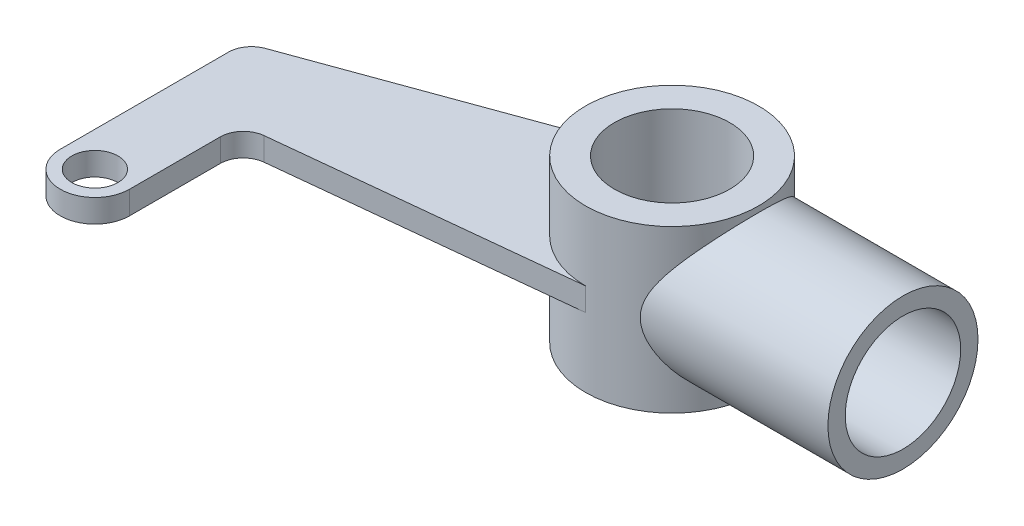
ISO-10303-21;
HEADER;
FILE_DESCRIPTION(('STEP AP214'),'2;1');
FILE_NAME('part.step','',(''),(''),'','','');
FILE_SCHEMA(('AUTOMOTIVE_DESIGN { 1 0 10303 214 1 1 1 1 }'));
ENDSEC;
DATA;
#1=APPLICATION_CONTEXT('core data for automotive mechanical design processes');
#2=APPLICATION_PROTOCOL_DEFINITION('international standard','automotive_design',2000,#1);
#3=PRODUCT_CONTEXT('',#1,'mechanical');
#4=PRODUCT('Part','Part','',(#3));
#5=PRODUCT_RELATED_PRODUCT_CATEGORY('part','',(#4));
#6=PRODUCT_DEFINITION_FORMATION('','',#4);
#7=PRODUCT_DEFINITION_CONTEXT('part definition',#1,'design');
#8=PRODUCT_DEFINITION('design','',#6,#7);
#9=PRODUCT_DEFINITION_SHAPE('','',#8);
#10=(LENGTH_UNIT() NAMED_UNIT(*) SI_UNIT(.MILLI.,.METRE.));
#11=(NAMED_UNIT(*) PLANE_ANGLE_UNIT() SI_UNIT($,.RADIAN.));
#12=(NAMED_UNIT(*) SI_UNIT($,.STERADIAN.) SOLID_ANGLE_UNIT());
#13=UNCERTAINTY_MEASURE_WITH_UNIT(LENGTH_MEASURE(1.E-05),#10,'distance_accuracy_value','');
#14=(GEOMETRIC_REPRESENTATION_CONTEXT(3) GLOBAL_UNCERTAINTY_ASSIGNED_CONTEXT((#13)) GLOBAL_UNIT_ASSIGNED_CONTEXT((#10,
#11,#12)) REPRESENTATION_CONTEXT('',''));
#15=CARTESIAN_POINT('',(0.,0.,0.));
#16=DIRECTION('',(0.,0.,1.));
#17=DIRECTION('',(1.,0.,0.));
#18=AXIS2_PLACEMENT_3D('',#15,#16,#17);
#19=CARTESIAN_POINT('',(0.,70.,0.));
#20=DIRECTION('',(0.,-1.,0.));
#21=DIRECTION('',(0.,0.,-1.));
#22=AXIS2_PLACEMENT_3D('',#19,#20,#21);
#23=CYLINDRICAL_SURFACE('',#22,37.5);
#24=DIRECTION('',(0.,-1.,0.));
#25=VECTOR('',#24,1.);
#26=CARTESIAN_POINT('',(-12.8257553747126,40.,-35.2384732794716));
#27=LINE('',#26,#25);
#28=CARTESIAN_POINT('',(-12.8257553747126,40.,-35.2384732794716));
#29=VERTEX_POINT('',#28);
#30=CARTESIAN_POINT('',(-12.8257553747126,30.,-35.2384732794716));
#31=VERTEX_POINT('',#30);
#32=EDGE_CURVE('E131',#29,#31,#27,.T.);
#33=ORIENTED_EDGE('',*,*,#32,.F.);
#34=CARTESIAN_POINT('',(0.,40.,0.));
#35=DIRECTION('',(0.,1.,0.));
#36=DIRECTION('',(0.,0.,1.));
#37=AXIS2_PLACEMENT_3D('',#34,#35,#36);
#38=CIRCLE('',#37,37.5);
#39=CARTESIAN_POINT('',(0.,40.,37.5));
#40=VERTEX_POINT('',#39);
#41=EDGE_CURVE('E164',#29,#40,#38,.T.);
#42=ORIENTED_EDGE('',*,*,#41,.T.);
#43=DIRECTION('',(0.,-1.,0.));
#44=VECTOR('',#43,1.);
#45=CARTESIAN_POINT('',(0.,40.,37.5));
#46=LINE('',#45,#44);
#47=CARTESIAN_POINT('',(0.,30.,37.5));
#48=VERTEX_POINT('',#47);
#49=EDGE_CURVE('E147',#40,#48,#46,.T.);
#50=ORIENTED_EDGE('',*,*,#49,.T.);
#51=CARTESIAN_POINT('',(0.,30.,0.));
#52=DIRECTION('',(0.,1.,0.));
#53=DIRECTION('',(0.,0.,1.));
#54=AXIS2_PLACEMENT_3D('',#51,#52,#53);
#55=CIRCLE('',#54,37.5);
#56=EDGE_CURVE('E148',#31,#48,#55,.T.);
#57=ORIENTED_EDGE('',*,*,#56,.F.);
#58=EDGE_LOOP('',(#33,#42,#50,#57));
#59=FACE_BOUND('',#58,.T.);
#60=CARTESIAN_POINT('',(0.,0.,0.));
#61=DIRECTION('',(0.,1.,0.));
#62=DIRECTION('',(0.,0.,1.));
#63=AXIS2_PLACEMENT_3D('',#60,#61,#62);
#64=CIRCLE('',#63,37.5);
#65=CARTESIAN_POINT('',(0.,0.,37.5));
#66=VERTEX_POINT('',#65);
#67=EDGE_CURVE('E220',#66,#66,#64,.T.);
#68=ORIENTED_EDGE('',*,*,#67,.T.);
#69=EDGE_LOOP('',(#68));
#70=FACE_BOUND('',#69,.T.);
#71=CARTESIAN_POINT('',(0.,70.,0.));
#72=DIRECTION('',(0.,1.,0.));
#73=DIRECTION('',(0.,0.,1.));
#74=AXIS2_PLACEMENT_3D('',#71,#72,#73);
#75=CIRCLE('',#74,37.5);
#76=CARTESIAN_POINT('',(0.,70.,37.5));
#77=VERTEX_POINT('',#76);
#78=EDGE_CURVE('E184',#77,#77,#75,.T.);
#79=ORIENTED_EDGE('',*,*,#78,.F.);
#80=EDGE_LOOP('',(#79));
#81=FACE_BOUND('',#80,.T.);
#82=CARTESIAN_POINT('',(18.7082869338697,35.,32.5));
#83=CARTESIAN_POINT('',(18.7083043022071,34.4660675695345,32.4999941225335));
#84=CARTESIAN_POINT('',(18.7312733105978,33.9320164639086,32.4868015820703));
#85=CARTESIAN_POINT('',(18.8218053502324,32.8689653778684,32.4344297910761));
#86=CARTESIAN_POINT('',(18.8893821258583,32.339967005263,32.3952425311289));
#87=CARTESIAN_POINT('',(19.0655385699566,31.2901030724317,32.2918813390293));
#88=CARTESIAN_POINT('',(19.1742160797346,30.7692600317192,32.2276477721166));
#89=CARTESIAN_POINT('',(19.42728070251,29.7399257839337,32.0757304141229));
#90=CARTESIAN_POINT('',(19.5716718245214,29.2314359706086,31.9880439902629));
#91=CARTESIAN_POINT('',(19.959237006877,28.0117994363563,31.7482380441458));
#92=CARTESIAN_POINT('',(20.2181481620015,27.3079126938245,31.5846435809103));
#93=CARTESIAN_POINT('',(20.7815821313981,25.9296923475213,31.2168063706547));
#94=CARTESIAN_POINT('',(21.0861307058918,25.2553757143804,31.0125406450373));
#95=CARTESIAN_POINT('',(21.7286852867957,23.9333660115807,30.5657959135613));
#96=CARTESIAN_POINT('',(22.0667925718991,23.2857624309407,30.3231998391055));
#97=CARTESIAN_POINT('',(22.765320735484,22.0177118311355,29.8023489442269));
#98=CARTESIAN_POINT('',(23.125739953274,21.3972627966937,29.5240967760644));
#99=CARTESIAN_POINT('',(23.7794456510669,20.3165544854451,28.9986711594801));
#100=CARTESIAN_POINT('',(24.0699134108835,19.851260797593,28.7582710745081));
#101=CARTESIAN_POINT('',(24.6565380972471,18.9354875842976,28.256927981852));
#102=CARTESIAN_POINT('',(24.952695571959,18.4850094976891,27.9959829872273));
#103=CARTESIAN_POINT('',(25.5481893522746,17.5983370986188,27.4536393914183));
#104=CARTESIAN_POINT('',(25.8475270738498,17.1621495348947,27.1722313228387));
#105=CARTESIAN_POINT('',(26.4469652905855,16.3041135681723,26.5891495034273));
#106=CARTESIAN_POINT('',(26.7470657598588,15.8822646853301,26.2874764317714));
#107=CARTESIAN_POINT('',(27.3456884951169,15.0533517538412,25.6641735650314));
#108=CARTESIAN_POINT('',(27.6442121255623,14.6462720793904,25.3425658983418));
#109=CARTESIAN_POINT('',(28.2381510902731,13.8466379411745,24.6790442461121));
#110=CARTESIAN_POINT('',(28.5335660973407,13.454084995688,24.337128147686));
#111=CARTESIAN_POINT('',(29.4122216326255,12.2991356074512,23.2810865463679));
#112=CARTESIAN_POINT('',(29.9883005691303,11.5588621667352,22.536227748904));
#113=CARTESIAN_POINT('',(30.9802865227855,10.3040553378671,21.1430464592879));
#114=CARTESIAN_POINT('',(31.4028725197087,9.77641936410365,20.5111807890814));
#115=CARTESIAN_POINT('',(32.2221729960013,8.7634366712037,19.1984349625766));
#116=CARTESIAN_POINT('',(32.6188882391693,8.27808870342944,18.517556254571));
#117=CARTESIAN_POINT('',(33.3794666384159,7.35479948342227,17.1085178263836));
#118=CARTESIAN_POINT('',(33.7433736722386,6.91679475341697,16.3804235636201));
#119=CARTESIAN_POINT('',(34.4322743967789,6.09268858253955,14.8778715040107));
#120=CARTESIAN_POINT('',(34.7572757863764,5.70657687090698,14.1034229256818));
#121=CARTESIAN_POINT('',(35.3058923549657,5.05788656682616,12.6580609120704));
#122=CARTESIAN_POINT('',(35.5371540059813,4.78565552716911,11.9943697687015));
#123=CARTESIAN_POINT('',(35.9656597835968,4.28280600690925,10.6407273200411));
#124=CARTESIAN_POINT('',(36.1629075796461,4.05218303746106,9.95077885723135));
#125=CARTESIAN_POINT('',(36.5198675767818,3.63581326658011,8.54825343565871));
#126=CARTESIAN_POINT('',(36.6795946517699,3.45004868164119,7.83568557123322));
#127=CARTESIAN_POINT('',(36.9585367871775,3.12618288869585,6.39194944587621));
#128=CARTESIAN_POINT('',(37.0777513974034,2.98808221035284,5.66078097834311));
#129=CARTESIAN_POINT('',(37.273672972222,2.76135899099699,4.18125681139628));
#130=CARTESIAN_POINT('',(37.350159982927,2.67299245511119,3.43283246052489));
#131=CARTESIAN_POINT('',(37.4579764323816,2.54848275517667,1.92839184636637));
#132=CARTESIAN_POINT('',(37.4893057712631,2.5123397066225,1.17237556629308));
#133=CARTESIAN_POINT('',(37.5060834539207,2.49298047237973,-0.340753671116683));
#134=CARTESIAN_POINT('',(37.4915372317256,2.50975801816767,-1.0978664879483));
#135=CARTESIAN_POINT('',(37.416910017904,2.59590117040115,-2.60679687796928));
#136=CARTESIAN_POINT('',(37.3568312478769,2.66526421112377,-3.35861470770252));
#137=CARTESIAN_POINT('',(37.1992149829224,2.84749636353658,-4.78998454409231));
#138=CARTESIAN_POINT('',(37.1051268682436,2.95636197809763,-5.47043517972536));
#139=CARTESIAN_POINT('',(36.881427200603,3.21566466396064,-6.81735620121358));
#140=CARTESIAN_POINT('',(36.7518180091912,3.36609897165401,-7.48382751328708));
#141=CARTESIAN_POINT('',(36.4592820273828,3.70644145314206,-8.79913387213584));
#142=CARTESIAN_POINT('',(36.2963531371297,3.89635211480702,-9.44796780445636));
#143=CARTESIAN_POINT('',(35.9397487534622,4.31324073046195,-10.7249244934574));
#144=CARTESIAN_POINT('',(35.7460713552333,4.54022098087085,-11.3530459641252));
#145=CARTESIAN_POINT('',(35.3158043414499,5.04628495741628,-12.6305320440628));
#146=CARTESIAN_POINT('',(35.077129634564,5.32794273830934,-13.2781725768435));
#147=CARTESIAN_POINT('',(34.5712017643138,5.92778037748321,-14.5446585759376));
#148=CARTESIAN_POINT('',(34.3039480208362,6.24596097713427,-15.1635034573745));
#149=CARTESIAN_POINT('',(33.7443059214522,6.91598078352045,-16.3711621618091));
#150=CARTESIAN_POINT('',(33.4519073366104,7.26783369480214,-16.9599636064444));
#151=CARTESIAN_POINT('',(32.8454846768685,8.00242861352655,-18.1064849196429));
#152=CARTESIAN_POINT('',(32.5314561697495,8.38517695457569,-18.6641983753066));
#153=CARTESIAN_POINT('',(31.9641830551384,9.08206511526062,-19.6155123126112));
#154=CARTESIAN_POINT('',(31.7148280726457,9.39012629235613,-20.0159232251342));
#155=CARTESIAN_POINT('',(31.2072165288768,10.0214985918369,-20.7984897089407));
#156=CARTESIAN_POINT('',(30.948961412231,10.3448072424296,-21.1806482190707));
#157=CARTESIAN_POINT('',(30.1626164105051,11.3368088947876,-22.3001844878062));
#158=CARTESIAN_POINT('',(29.6230902247481,12.0274025382207,-23.0103852603403));
#159=CARTESIAN_POINT('',(28.5237964600079,13.463492400634,-24.3598540726815));
#160=CARTESIAN_POINT('',(27.9639834073517,14.2091164138212,-24.9989477747504));
#161=CARTESIAN_POINT('',(26.8372134709904,15.7512634719527,-26.2048491655456));
#162=CARTESIAN_POINT('',(26.2702586562582,16.5477720360122,-26.7716772834931));
#163=CARTESIAN_POINT('',(25.2413299365144,18.0480640880961,-27.7404721976782));
#164=CARTESIAN_POINT('',(24.7783171419639,18.7437415915584,-28.1539414186217));
#165=CARTESIAN_POINT('',(23.866037348356,20.1713227671937,-28.9313174167041));
#166=CARTESIAN_POINT('',(23.4167733561948,20.9032342734967,-29.295213411278));
#167=CARTESIAN_POINT('',(22.5455157142376,22.4034703645888,-29.9708644584889));
#168=CARTESIAN_POINT('',(22.1234527675247,23.1716930145467,-30.2827555033572));
#169=CARTESIAN_POINT('',(21.3217815138537,24.7491679200416,-30.8524358276319));
#170=CARTESIAN_POINT('',(20.9421408522624,25.5583882133282,-31.1102664711973));
#171=CARTESIAN_POINT('',(20.3987077211667,26.858245332786,-31.4674155653084));
#172=CARTESIAN_POINT('',(20.2129016257266,27.3341970571292,-31.5868741823117));
#173=CARTESIAN_POINT('',(19.8667726825018,28.2998608354776,-31.805709827007));
#174=CARTESIAN_POINT('',(19.7064469317207,28.7895713144447,-31.9050891427009));
#175=CARTESIAN_POINT('',(19.4168890065196,29.7808435335452,-32.0821329011768));
#176=CARTESIAN_POINT('',(19.2875890472682,30.2823767592783,-32.1598447441718));
#177=CARTESIAN_POINT('',(19.0649378938387,31.2964402615863,-32.2923365784122));
#178=CARTESIAN_POINT('',(18.9715855781851,31.8089701945651,-32.3471172850557));
#179=CARTESIAN_POINT('',(18.8245441534177,32.8480480034275,-32.4329149842568));
#180=CARTESIAN_POINT('',(18.7713420138195,33.3746901889247,-32.4636403791458));
#181=CARTESIAN_POINT('',(18.7094929427089,34.4314572508869,-32.4993260783202));
#182=CARTESIAN_POINT('',(18.7008424013531,34.9615818417009,-32.504288470082));
#183=CARTESIAN_POINT('',(18.7286171882465,36.020479893398,-32.4882922973686));
#184=CARTESIAN_POINT('',(18.7650630110207,36.5492526304507,-32.467321947484));
#185=CARTESIAN_POINT('',(18.8809171103763,37.6004243916048,-32.4000826612063));
#186=CARTESIAN_POINT('',(18.960332311666,38.1228223745068,-32.3538096471624));
#187=CARTESIAN_POINT('',(19.1729063698775,39.235833918736,-32.2283581562522));
#188=CARTESIAN_POINT('',(19.3123856828298,39.8247887444941,-32.1452559036319));
#189=CARTESIAN_POINT('',(19.6345618447748,40.9856100443482,-31.9494808397581));
#190=CARTESIAN_POINT('',(19.8172695913859,41.5574721684702,-31.8368005712862));
#191=CARTESIAN_POINT('',(20.2180653838454,42.6842991462857,-31.5837950866418));
#192=CARTESIAN_POINT('',(20.4362627821891,43.2392052684371,-31.4433841292754));
#193=CARTESIAN_POINT('',(20.8999529158297,44.3301637653062,-31.1371022204275));
#194=CARTESIAN_POINT('',(21.145447144467,44.8662151064128,-30.971229875829));
#195=CARTESIAN_POINT('',(21.6203408843042,45.8440978707292,-30.6411825542736));
#196=CARTESIAN_POINT('',(21.8469634358845,46.2883769594209,-30.4802060858159));
#197=CARTESIAN_POINT('',(22.3120885837717,47.1641682173402,-30.1413917547387));
#198=CARTESIAN_POINT('',(22.5505929757376,47.5956784410531,-29.9635513398413));
#199=CARTESIAN_POINT('',(23.0367179742848,48.4466509423564,-29.591440729381));
#200=CARTESIAN_POINT('',(23.2843437026199,48.866106208164,-29.3971612211162));
#201=CARTESIAN_POINT('',(23.7861478452416,49.6931510400789,-28.9926394758951));
#202=CARTESIAN_POINT('',(24.0403259612622,50.1007411444986,-28.7823979646878));
#203=CARTESIAN_POINT('',(24.8102625363844,51.3074998131547,-28.1274708590957));
#204=CARTESIAN_POINT('',(25.3328171378199,52.0896165338526,-27.6590397185096));
#205=CARTESIAN_POINT('',(26.3820891431732,53.6095645774273,-26.660095659204));
#206=CARTESIAN_POINT('',(26.9088054932529,54.3474067289623,-26.1295980150894));
#207=CARTESIAN_POINT('',(27.9892352974585,55.8246712385639,-24.9703775165026));
#208=CARTESIAN_POINT('',(28.5425279732296,56.561192852862,-24.337547840276));
#209=CARTESIAN_POINT('',(29.6304229067152,57.9819571685857,-23.0006796954062));
#210=CARTESIAN_POINT('',(30.1650216192522,58.6661899826641,-22.2966278174768));
#211=CARTESIAN_POINT('',(31.203503832422,59.9763419987933,-20.8183822108181));
#212=CARTESIAN_POINT('',(31.707452492923,60.6023865181141,-20.0443466507955));
#213=CARTESIAN_POINT('',(32.4327344299982,61.4936191815385,-18.8305599123308));
#214=CARTESIAN_POINT('',(32.6693602708407,61.7826908800059,-18.4172309862995));
#215=CARTESIAN_POINT('',(33.1311487544236,62.3440768786884,-17.5729483965897));
#216=CARTESIAN_POINT('',(33.3563086712072,62.6163871971653,-17.1419905852566));
#217=CARTESIAN_POINT('',(33.889023453263,63.2579253627132,-16.0711250205991));
#218=CARTESIAN_POINT('',(34.1897061915367,63.617651149407,-15.4220301391985));
#219=CARTESIAN_POINT('',(34.7598631684514,64.2964500258601,-14.089948532444));
#220=CARTESIAN_POINT('',(35.0293453824976,64.6155335066085,-13.4069705322616));
#221=CARTESIAN_POINT('',(35.5327109708505,65.2092422703682,-12.0094848341287));
#222=CARTESIAN_POINT('',(35.7666062683533,65.4838824458288,-11.2949878004067));
#223=CARTESIAN_POINT('',(36.1945910459138,65.9849219910809,-9.83759559811113));
#224=CARTESIAN_POINT('',(36.3886797102327,66.2113203722796,-9.0946998479459));
#225=CARTESIAN_POINT('',(36.7344275038777,66.6137447645965,-7.57896884080374));
#226=CARTESIAN_POINT('',(36.8857347892347,66.7893533238414,-6.80594161864514));
#227=CARTESIAN_POINT('',(37.1403514951975,67.0844398200599,-5.24140453772347));
#228=CARTESIAN_POINT('',(37.2436608654861,67.2039176981906,-4.44989465958553));
#229=CARTESIAN_POINT('',(37.3996803343011,67.3842266122414,-2.85569325367526));
#230=CARTESIAN_POINT('',(37.4524182498702,67.4450898894505,-2.05300811970493));
#231=CARTESIAN_POINT('',(37.5060150553932,67.5069441324076,-0.443644933328548));
#232=CARTESIAN_POINT('',(37.5068797371337,67.5079417823144,0.363032663249977));
#233=CARTESIAN_POINT('',(37.4597861894375,67.4535930947755,1.87492017345647));
#234=CARTESIAN_POINT('',(37.4177336781183,67.405062243483,2.58057623205526));
#235=CARTESIAN_POINT('',(37.2944432380231,67.2626219546346,3.98376840178839));
#236=CARTESIAN_POINT('',(37.2132091027039,67.1687169100814,4.68130529230402));
#237=CARTESIAN_POINT('',(37.0131191326547,66.9370379271838,6.06356310325454));
#238=CARTESIAN_POINT('',(36.8942614883564,66.799261878785,6.74828340557521));
#239=CARTESIAN_POINT('',(36.621088703392,66.4819099957532,8.1007329319464));
#240=CARTESIAN_POINT('',(36.4667718542545,66.3023321470486,8.76846133558236));
#241=CARTESIAN_POINT('',(36.1235337708955,65.9017872651271,10.0901594821425));
#242=CARTESIAN_POINT('',(35.9342732907331,65.6804139434899,10.7439173782334));
#243=CARTESIAN_POINT('',(35.5252058605515,65.2002657551886,12.0276183500625));
#244=CARTESIAN_POINT('',(35.3053996399896,64.9414917816768,12.6575619940478));
#245=CARTESIAN_POINT('',(34.8383164801205,64.3892836332794,13.8916204586141));
#246=CARTESIAN_POINT('',(34.591034310326,64.0958428583377,14.4957303309057));
#247=CARTESIAN_POINT('',(34.0721223321423,63.4769726027256,15.6766232384404));
#248=CARTESIAN_POINT('',(33.8004875170851,63.1515365427993,16.2534006169582));
#249=CARTESIAN_POINT('',(33.3111201282707,62.5617512569333,17.2288348188881));
#250=CARTESIAN_POINT('',(33.0982620350492,62.3041704396679,17.6340716426352));
#251=CARTESIAN_POINT('',(32.6623846060453,61.7741306307833,18.428892092189));
#252=CARTESIAN_POINT('',(32.4393670686334,61.5016742706712,18.8184784655555));
#253=CARTESIAN_POINT('',(31.7565837932338,60.6629382132892,19.9639573699814));
#254=CARTESIAN_POINT('',(31.2831845036452,60.0754080484433,20.6963781212634));
#255=CARTESIAN_POINT('',(30.308315371783,58.8481328960405,22.0994995883171));
#256=CARTESIAN_POINT('',(29.8067785946935,58.208261585656,22.7700421455458));
#257=CARTESIAN_POINT('',(28.7858496969585,56.8816052366319,24.0477312953831));
#258=CARTESIAN_POINT('',(28.2664601548828,56.1948269589893,24.6548869925743));
#259=CARTESIAN_POINT('',(27.2085951932036,54.7622467765438,25.8180608197355));
#260=CARTESIAN_POINT('',(26.6699460762953,54.0155344051957,26.3728020380576));
#261=CARTESIAN_POINT('',(25.8638825414034,52.8610157129449,27.1560359624358));
#262=CARTESIAN_POINT('',(25.5954407174394,52.4703241423518,27.4090294205238));
#263=CARTESIAN_POINT('',(25.0608568900814,51.6773037002306,27.8986509929486));
#264=CARTESIAN_POINT('',(24.7947146894752,51.2749758397395,28.1352805230686));
#265=CARTESIAN_POINT('',(24.2669888534232,50.4590871654665,28.5916905378838));
#266=CARTESIAN_POINT('',(24.005398545146,50.0455455588953,28.8114976379462));
#267=CARTESIAN_POINT('',(23.4884366202332,49.2061959057761,29.2344808729431));
#268=CARTESIAN_POINT('',(23.2330653112469,48.7803872546519,29.4376561862848));
#269=CARTESIAN_POINT('',(22.7311990220368,47.9163090901015,29.8268897443525));
#270=CARTESIAN_POINT('',(22.4846983458228,47.478047908353,30.0129590969323));
#271=CARTESIAN_POINT('',(22.0033793576791,46.5882990879075,30.3675919296016));
#272=CARTESIAN_POINT('',(21.768559155093,46.1368136086785,30.5361582476497));
#273=CARTESIAN_POINT('',(21.2926380860801,45.1767531426813,30.8701440920882));
#274=CARTESIAN_POINT('',(21.0530292403586,44.6668066065506,31.0337714405052));
#275=CARTESIAN_POINT('',(20.5974290751043,43.6296596611295,31.3380116197375));
#276=CARTESIAN_POINT('',(20.3814380765027,43.102459017508,31.4786241378287));
#277=CARTESIAN_POINT('',(19.9801738251223,42.0322599276257,31.7348260527466));
#278=CARTESIAN_POINT('',(19.7948142754056,41.4893111099887,31.8504860387999));
#279=CARTESIAN_POINT('',(19.46141720156,40.3872081721092,32.0552906180935));
#280=CARTESIAN_POINT('',(19.3133622377616,39.8280617609679,32.1444476048442));
#281=CARTESIAN_POINT('',(19.1103829394042,38.9143192736204,32.2653267738634));
#282=CARTESIAN_POINT('',(19.0415572869526,38.5639429536376,32.3059414774554));
#283=CARTESIAN_POINT('',(18.9222942771702,37.8589867195852,32.3759414144173));
#284=CARTESIAN_POINT('',(18.8718535769833,37.5044075818138,32.4053286892689));
#285=CARTESIAN_POINT('',(18.7906152759828,36.7922841827236,32.452503836139));
#286=CARTESIAN_POINT('',(18.7598141547081,36.4347404644623,32.4702937870301));
#287=CARTESIAN_POINT('',(18.7186454295054,35.7181489277583,32.4940431005912));
#288=CARTESIAN_POINT('',(18.7082752526301,35.3591013044159,32.5000039529457));
#289=CARTESIAN_POINT('',(18.7082869338697,35.,32.5));
#290=B_SPLINE_CURVE_WITH_KNOTS('',3,(#82,#83,#84,#85,#86,#87,#88,#89,#90,#91,#92,#93,#94,#95,
#96,#97,#98,#99,#100,#101,#102,#103,#104,#105,#106,#107,#108,#109,#110,#111,#112,#113,#114,#115,
#116,#117,#118,#119,#120,#121,#122,#123,#124,#125,#126,#127,#128,#129,#130,#131,#132,#133,#134,
#135,#136,#137,#138,#139,#140,#141,#142,#143,#144,#145,#146,#147,#148,#149,#150,#151,#152,#153,
#154,#155,#156,#157,#158,#159,#160,#161,#162,#163,#164,#165,#166,#167,#168,#169,#170,#171,#172,
#173,#174,#175,#176,#177,#178,#179,#180,#181,#182,#183,#184,#185,#186,#187,#188,#189,#190,#191,
#192,#193,#194,#195,#196,#197,#198,#199,#200,#201,#202,#203,#204,#205,#206,#207,#208,#209,#210,
#211,#212,#213,#214,#215,#216,#217,#218,#219,#220,#221,#222,#223,#224,#225,#226,#227,#228,#229,
#230,#231,#232,#233,#234,#235,#236,#237,#238,#239,#240,#241,#242,#243,#244,#245,#246,#247,#248,
#249,#250,#251,#252,#253,#254,#255,#256,#257,#258,#259,#260,#261,#262,#263,#264,#265,#266,#267,
#268,#269,#270,#271,#272,#273,#274,#275,#276,#277,#278,#279,#280,#281,#282,#283,#284,#285,#286,
#287,#288,#289),.UNSPECIFIED.,.T.,.F.,(4,2,2,2,2,2,2,2,2,2,2,2,2,2,2,2,2,2,2,2,2,2,2,2,2,2,2,2,
2,2,2,2,2,2,2,2,2,2,2,2,2,2,2,2,2,2,2,2,2,2,2,2,2,2,2,2,2,2,2,2,2,2,2,2,2,2,2,2,2,2,2,2,2,2,2,2,
2,2,2,2,2,2,2,2,2,2,2,2,2,2,2,2,2,2,2,2,2,2,2,2,2,2,2,4),(0.,1.60136676259084,3.20322716289993,
4.80892508204454,6.4148033298938,8.71381906469229,11.0141374104004,13.3216222606171,
15.6289355692728,17.4250382841574,19.2213149177068,21.0184279656169,22.8154808137991,
24.610573379495,26.4058530345956,29.9938736024818,32.7675808131596,35.5412060968239,
38.3110651275068,41.0803751327856,43.3393238505847,45.5980287180226,47.8558366766808,
50.1136697243392,52.3830210317534,54.6523773579313,56.9214648855581,59.1904417082226,
61.2746200512347,63.3586598652846,65.4428310590846,67.5271314139327,69.7614230859768,
71.995760119536,74.2310104217291,76.4667201228237,78.1563152436061,79.8456373966563,
83.225262826075,86.6129997394429,89.9997768180756,92.7949653035595,95.5907607970206,
98.3791265963176,101.165351036554,102.738526281249,104.311522164115,105.881049435585,
107.450527737806,109.038748690046,110.626840952878,112.215655206383,113.804725580734,
115.634596324553,117.464928859805,119.301011835557,121.137195308225,122.708832876497,
124.280708685414,125.853480997023,127.426181841717,130.575436382452,133.723917513534,
137.073211146367,140.423136541762,143.765671564498,145.436516911608,147.107757655464,
149.507576119364,151.906779786551,154.305177835483,156.703625028759,159.121259062937,
161.538895631568,163.955201604861,166.371237790573,168.494396567788,170.617349827873,
172.740405210617,174.863562906436,177.008534560371,179.153454999422,181.298784460308,
183.444555996054,185.019725609169,186.594617469469,189.745131597383,192.90348735204,
196.061388829765,199.2829208024,200.894558690192,202.506056966534,204.114950534929,
205.723923533082,207.331844244529,208.939503837746,210.698602817235,212.457725697276,
214.211804901136,215.965062555667,217.042601764888,218.119944951976,219.197094967313,
220.274109324342),.UNSPECIFIED.);
#291=CARTESIAN_POINT('',(18.7082869338697,35.,32.5));
#292=VERTEX_POINT('',#291);
#293=EDGE_CURVE('E176',#292,#292,#290,.T.);
#294=ORIENTED_EDGE('',*,*,#293,.F.);
#295=EDGE_LOOP('',(#294));
#296=FACE_BOUND('',#295,.T.);
#297=ADVANCED_FACE('F37',(#59,#70,#81,#296),#23,.T.);
#298=CARTESIAN_POINT('',(0.,70.,0.));
#299=DIRECTION('',(0.,1.,0.));
#300=DIRECTION('',(0.,0.,1.));
#301=AXIS2_PLACEMENT_3D('',#298,#299,#300);
#302=PLANE('',#301);
#303=ORIENTED_EDGE('',*,*,#78,.T.);
#304=EDGE_LOOP('',(#303));
#305=FACE_BOUND('',#304,.T.);
#306=CARTESIAN_POINT('',(0.,70.,0.));
#307=DIRECTION('',(0.,1.,0.));
#308=DIRECTION('',(0.,0.,1.));
#309=AXIS2_PLACEMENT_3D('',#306,#307,#308);
#310=CIRCLE('',#309,25.);
#311=CARTESIAN_POINT('',(0.,70.,25.));
#312=VERTEX_POINT('',#311);
#313=EDGE_CURVE('E185',#312,#312,#310,.T.);
#314=ORIENTED_EDGE('',*,*,#313,.F.);
#315=EDGE_LOOP('',(#314));
#316=FACE_BOUND('',#315,.T.);
#317=ADVANCED_FACE('F204',(#305,#316),#302,.T.);
#318=CARTESIAN_POINT('',(0.,0.,0.));
#319=DIRECTION('',(0.,1.,0.));
#320=DIRECTION('',(0.,0.,1.));
#321=AXIS2_PLACEMENT_3D('',#318,#319,#320);
#322=PLANE('',#321);
#323=ORIENTED_EDGE('',*,*,#67,.F.);
#324=EDGE_LOOP('',(#323));
#325=FACE_BOUND('',#324,.T.);
#326=CARTESIAN_POINT('',(0.,0.,0.));
#327=DIRECTION('',(0.,1.,0.));
#328=DIRECTION('',(0.,0.,1.));
#329=AXIS2_PLACEMENT_3D('',#326,#327,#328);
#330=CIRCLE('',#329,25.);
#331=CARTESIAN_POINT('',(0.,0.,25.));
#332=VERTEX_POINT('',#331);
#333=EDGE_CURVE('E175',#332,#332,#330,.T.);
#334=ORIENTED_EDGE('',*,*,#333,.T.);
#335=EDGE_LOOP('',(#334));
#336=FACE_BOUND('',#335,.T.);
#337=ADVANCED_FACE('F195',(#325,#336),#322,.F.);
#338=CARTESIAN_POINT('',(100.,35.,0.));
#339=DIRECTION('',(-1.,0.,0.));
#340=DIRECTION('',(0.,0.,1.));
#341=AXIS2_PLACEMENT_3D('',#338,#339,#340);
#342=CYLINDRICAL_SURFACE('',#341,32.5);
#343=CARTESIAN_POINT('',(100.,35.,0.));
#344=DIRECTION('',(1.,0.,0.));
#345=DIRECTION('',(0.,0.,-1.));
#346=AXIS2_PLACEMENT_3D('',#343,#344,#345);
#347=CIRCLE('',#346,32.5);
#348=CARTESIAN_POINT('',(100.,35.,-32.5));
#349=VERTEX_POINT('',#348);
#350=EDGE_CURVE('E172',#349,#349,#347,.T.);
#351=ORIENTED_EDGE('',*,*,#350,.F.);
#352=EDGE_LOOP('',(#351));
#353=FACE_BOUND('',#352,.T.);
#354=ORIENTED_EDGE('',*,*,#293,.T.);
#355=EDGE_LOOP('',(#354));
#356=FACE_BOUND('',#355,.T.);
#357=ADVANCED_FACE('F189',(#353,#356),#342,.T.);
#358=CARTESIAN_POINT('',(100.,35.,0.));
#359=DIRECTION('',(-1.,0.,0.));
#360=DIRECTION('',(0.,0.,1.));
#361=AXIS2_PLACEMENT_3D('',#358,#359,#360);
#362=CYLINDRICAL_SURFACE('',#361,25.);
#363=CARTESIAN_POINT('',(100.,35.,0.));
#364=DIRECTION('',(1.,0.,0.));
#365=DIRECTION('',(0.,0.,-1.));
#366=AXIS2_PLACEMENT_3D('',#363,#364,#365);
#367=CIRCLE('',#366,25.);
#368=CARTESIAN_POINT('',(100.,35.,-25.));
#369=VERTEX_POINT('',#368);
#370=EDGE_CURVE('E169',#369,#369,#367,.T.);
#371=ORIENTED_EDGE('',*,*,#370,.T.);
#372=EDGE_LOOP('',(#371));
#373=FACE_BOUND('',#372,.T.);
#374=CARTESIAN_POINT('',(0.,35.,0.));
#375=DIRECTION('',(0.707106781186547,-0.707106781186547,0.));
#376=DIRECTION('',(-0.707106781186547,-0.707106781186547,0.));
#377=AXIS2_PLACEMENT_3D('',#374,#375,#376);
#378=ELLIPSE('',#377,35.3553390593274,25.);
#379=CARTESIAN_POINT('',(0.,35.,25.));
#380=VERTEX_POINT('',#379);
#381=CARTESIAN_POINT('',(0.,35.,-25.));
#382=VERTEX_POINT('',#381);
#383=EDGE_CURVE('E230',#380,#382,#378,.F.);
#384=ORIENTED_EDGE('',*,*,#383,.T.);
#385=CARTESIAN_POINT('',(0.,35.,0.));
#386=DIRECTION('',(-0.707106781186547,-0.707106781186547,0.));
#387=DIRECTION('',(0.707106781186547,-0.707106781186547,0.));
#388=AXIS2_PLACEMENT_3D('',#385,#386,#387);
#389=ELLIPSE('',#388,35.3553390593274,25.);
#390=EDGE_CURVE('E183',#382,#380,#389,.T.);
#391=ORIENTED_EDGE('',*,*,#390,.T.);
#392=EDGE_LOOP('',(#384,#391));
#393=FACE_BOUND('',#392,.T.);
#394=ADVANCED_FACE('F194',(#373,#393),#362,.F.);
#395=CARTESIAN_POINT('',(100.,35.,0.));
#396=DIRECTION('',(1.,0.,0.));
#397=DIRECTION('',(0.,0.,-1.));
#398=AXIS2_PLACEMENT_3D('',#395,#396,#397);
#399=PLANE('',#398);
#400=ORIENTED_EDGE('',*,*,#350,.T.);
#401=EDGE_LOOP('',(#400));
#402=FACE_BOUND('',#401,.T.);
#403=ORIENTED_EDGE('',*,*,#370,.F.);
#404=EDGE_LOOP('',(#403));
#405=FACE_BOUND('',#404,.T.);
#406=ADVANCED_FACE('F197',(#402,#405),#399,.T.);
#407=CARTESIAN_POINT('',(0.,70.,0.));
#408=DIRECTION('',(0.,-1.,0.));
#409=DIRECTION('',(0.,0.,-1.));
#410=AXIS2_PLACEMENT_3D('',#407,#408,#409);
#411=CYLINDRICAL_SURFACE('',#410,25.);
#412=ORIENTED_EDGE('',*,*,#383,.F.);
#413=ORIENTED_EDGE('',*,*,#390,.F.);
#414=EDGE_LOOP('',(#412,#413));
#415=FACE_BOUND('',#414,.T.);
#416=ORIENTED_EDGE('',*,*,#313,.T.);
#417=EDGE_LOOP('',(#416));
#418=FACE_BOUND('',#417,.T.);
#419=ORIENTED_EDGE('',*,*,#333,.F.);
#420=EDGE_LOOP('',(#419));
#421=FACE_BOUND('',#420,.T.);
#422=ADVANCED_FACE('F199',(#415,#418,#421),#411,.F.);
#423=CARTESIAN_POINT('',(-12.8257553747126,40.,-35.2384732794716));
#424=DIRECTION('',(0.34202014332567,0.,0.939692620785908));
#425=DIRECTION('',(0.939692620785908,0.,-0.34202014332567));
#426=AXIS2_PLACEMENT_3D('',#423,#424,#425);
#427=PLANE('',#426);
#428=DIRECTION('',(-0.939692620785908,0.,0.34202014332567));
#429=VECTOR('',#428,1.);
#430=CARTESIAN_POINT('',(-12.8257553747126,30.,-35.2384732794716));
#431=LINE('',#430,#429);
#432=CARTESIAN_POINT('',(-158.420201433257,30.,17.7535713603148));
#433=VERTEX_POINT('',#432);
#434=EDGE_CURVE('E151',#31,#433,#431,.T.);
#435=ORIENTED_EDGE('',*,*,#434,.T.);
#436=DIRECTION('',(0.,-1.,0.));
#437=VECTOR('',#436,1.);
#438=CARTESIAN_POINT('',(-158.420201433257,40.,17.7535713603148));
#439=LINE('',#438,#437);
#440=CARTESIAN_POINT('',(-158.420201433257,40.,17.7535713603148));
#441=VERTEX_POINT('',#440);
#442=EDGE_CURVE('E52',#433,#441,#439,.F.);
#443=ORIENTED_EDGE('',*,*,#442,.T.);
#444=DIRECTION('',(-0.939692620785908,0.,0.34202014332567));
#445=VECTOR('',#444,1.);
#446=CARTESIAN_POINT('',(-12.8257553747126,40.,-35.2384732794716));
#447=LINE('',#446,#445);
#448=EDGE_CURVE('E122',#29,#441,#447,.T.);
#449=ORIENTED_EDGE('',*,*,#448,.F.);
#450=ORIENTED_EDGE('',*,*,#32,.T.);
#451=EDGE_LOOP('',(#435,#443,#449,#450));
#452=FACE_BOUND('',#451,.T.);
#453=ADVANCED_FACE('F202',(#452),#427,.F.);
#454=CARTESIAN_POINT('',(-165.,40.,0.));
#455=DIRECTION('',(1.,0.,0.));
#456=DIRECTION('',(0.,0.,-1.));
#457=AXIS2_PLACEMENT_3D('',#454,#455,#456);
#458=PLANE('',#457);
#459=DIRECTION('',(0.,0.,1.));
#460=VECTOR('',#459,1.);
#461=CARTESIAN_POINT('',(-165.,40.,0.));
#462=LINE('',#461,#460);
#463=CARTESIAN_POINT('',(-165.,40.,27.1504975681739));
#464=VERTEX_POINT('',#463);
#465=CARTESIAN_POINT('',(-165.,40.,100.));
#466=VERTEX_POINT('',#465);
#467=EDGE_CURVE('E109',#464,#466,#462,.T.);
#468=ORIENTED_EDGE('',*,*,#467,.F.);
#469=DIRECTION('',(0.,-1.,0.));
#470=VECTOR('',#469,1.);
#471=CARTESIAN_POINT('',(-165.,40.,27.1504975681739));
#472=LINE('',#471,#470);
#473=CARTESIAN_POINT('',(-165.,30.,27.1504975681739));
#474=VERTEX_POINT('',#473);
#475=EDGE_CURVE('E237',#464,#474,#472,.T.);
#476=ORIENTED_EDGE('',*,*,#475,.T.);
#477=DIRECTION('',(0.,0.,1.));
#478=VECTOR('',#477,1.);
#479=CARTESIAN_POINT('',(-165.,30.,0.));
#480=LINE('',#479,#478);
#481=CARTESIAN_POINT('',(-165.,30.,100.));
#482=VERTEX_POINT('',#481);
#483=EDGE_CURVE('E127',#474,#482,#480,.T.);
#484=ORIENTED_EDGE('',*,*,#483,.T.);
#485=DIRECTION('',(0.,-1.,0.));
#486=VECTOR('',#485,1.);
#487=CARTESIAN_POINT('',(-165.,40.,100.));
#488=LINE('',#487,#486);
#489=EDGE_CURVE('E125',#466,#482,#488,.T.);
#490=ORIENTED_EDGE('',*,*,#489,.F.);
#491=EDGE_LOOP('',(#468,#476,#484,#490));
#492=FACE_BOUND('',#491,.T.);
#493=ADVANCED_FACE('F126',(#492),#458,.F.);
#494=CARTESIAN_POINT('',(-150.,40.,100.));
#495=DIRECTION('',(0.,-1.,0.));
#496=DIRECTION('',(0.,0.,-1.));
#497=AXIS2_PLACEMENT_3D('',#494,#495,#496);
#498=CYLINDRICAL_SURFACE('',#497,15.);
#499=CARTESIAN_POINT('',(-150.,30.,100.));
#500=DIRECTION('',(0.,1.,0.));
#501=DIRECTION('',(0.,0.,1.));
#502=AXIS2_PLACEMENT_3D('',#499,#500,#501);
#503=CIRCLE('',#502,15.);
#504=CARTESIAN_POINT('',(-135.,30.,100.));
#505=VERTEX_POINT('',#504);
#506=EDGE_CURVE('E154',#482,#505,#503,.T.);
#507=ORIENTED_EDGE('',*,*,#506,.T.);
#508=DIRECTION('',(0.,-1.,0.));
#509=VECTOR('',#508,1.);
#510=CARTESIAN_POINT('',(-135.,40.,100.));
#511=LINE('',#510,#509);
#512=CARTESIAN_POINT('',(-135.,40.,100.));
#513=VERTEX_POINT('',#512);
#514=EDGE_CURVE('E132',#513,#505,#511,.T.);
#515=ORIENTED_EDGE('',*,*,#514,.F.);
#516=CARTESIAN_POINT('',(-150.,40.,100.));
#517=DIRECTION('',(0.,1.,0.));
#518=DIRECTION('',(0.,0.,1.));
#519=AXIS2_PLACEMENT_3D('',#516,#517,#518);
#520=CIRCLE('',#519,15.);
#521=EDGE_CURVE('E115',#466,#513,#520,.T.);
#522=ORIENTED_EDGE('',*,*,#521,.F.);
#523=ORIENTED_EDGE('',*,*,#489,.T.);
#524=EDGE_LOOP('',(#507,#515,#522,#523));
#525=FACE_BOUND('',#524,.T.);
#526=ADVANCED_FACE('F134',(#525),#498,.T.);
#527=CARTESIAN_POINT('',(-135.,40.,0.));
#528=DIRECTION('',(1.,0.,0.));
#529=DIRECTION('',(0.,0.,-1.));
#530=AXIS2_PLACEMENT_3D('',#527,#528,#529);
#531=PLANE('',#530);
#532=DIRECTION('',(0.,0.,1.));
#533=VECTOR('',#532,1.);
#534=CARTESIAN_POINT('',(-135.,30.,0.));
#535=LINE('',#534,#533);
#536=CARTESIAN_POINT('',(-135.,30.,60.6931122038449));
#537=VERTEX_POINT('',#536);
#538=EDGE_CURVE('E156',#537,#505,#535,.T.);
#539=ORIENTED_EDGE('',*,*,#538,.F.);
#540=DIRECTION('',(0.,-1.,0.));
#541=VECTOR('',#540,1.);
#542=CARTESIAN_POINT('',(-135.,40.,60.6931122038449));
#543=LINE('',#542,#541);
#544=CARTESIAN_POINT('',(-135.,40.,60.6931122038449));
#545=VERTEX_POINT('',#544);
#546=EDGE_CURVE('E235',#537,#545,#543,.F.);
#547=ORIENTED_EDGE('',*,*,#546,.T.);
#548=DIRECTION('',(0.,0.,1.));
#549=VECTOR('',#548,1.);
#550=CARTESIAN_POINT('',(-135.,40.,0.));
#551=LINE('',#550,#549);
#552=EDGE_CURVE('E136',#545,#513,#551,.T.);
#553=ORIENTED_EDGE('',*,*,#552,.T.);
#554=ORIENTED_EDGE('',*,*,#514,.T.);
#555=EDGE_LOOP('',(#539,#547,#553,#554));
#556=FACE_BOUND('',#555,.T.);
#557=ADVANCED_FACE('F249',(#556),#531,.T.);
#558=CARTESIAN_POINT('',(3.89834420283303,40.,37.0902675137589));
#559=DIRECTION('',(0.104528463267654,0.,0.994521895368273));
#560=DIRECTION('',(0.994521895368273,0.,-0.104528463267654));
#561=AXIS2_PLACEMENT_3D('',#558,#559,#560);
#562=PLANE('',#561);
#563=DIRECTION('',(-0.994521895368273,0.,0.104528463267654));
#564=VECTOR('',#563,1.);
#565=CARTESIAN_POINT('',(3.89834420283303,40.,37.0902675137589));
#566=LINE('',#565,#564);
#567=CARTESIAN_POINT('',(-126.045284632677,40.,50.7478932501621));
#568=VERTEX_POINT('',#567);
#569=EDGE_CURVE('E138',#40,#568,#566,.T.);
#570=ORIENTED_EDGE('',*,*,#569,.T.);
#571=DIRECTION('',(0.,-1.,0.));
#572=VECTOR('',#571,1.);
#573=CARTESIAN_POINT('',(-126.045284632676,30.,50.7478932501621));
#574=LINE('',#573,#572);
#575=CARTESIAN_POINT('',(-126.045284632677,30.,50.7478932501621));
#576=VERTEX_POINT('',#575);
#577=EDGE_CURVE('E232',#568,#576,#574,.T.);
#578=ORIENTED_EDGE('',*,*,#577,.T.);
#579=DIRECTION('',(-0.994521895368273,0.,0.104528463267654));
#580=VECTOR('',#579,1.);
#581=CARTESIAN_POINT('',(3.89834420283303,30.,37.0902675137589));
#582=LINE('',#581,#580);
#583=EDGE_CURVE('E158',#48,#576,#582,.T.);
#584=ORIENTED_EDGE('',*,*,#583,.F.);
#585=ORIENTED_EDGE('',*,*,#49,.F.);
#586=EDGE_LOOP('',(#570,#578,#584,#585));
#587=FACE_BOUND('',#586,.T.);
#588=ADVANCED_FACE('F256',(#587),#562,.T.);
#589=CARTESIAN_POINT('',(-150.,40.,100.));
#590=DIRECTION('',(0.,-1.,0.));
#591=DIRECTION('',(0.,0.,-1.));
#592=AXIS2_PLACEMENT_3D('',#589,#590,#591);
#593=CYLINDRICAL_SURFACE('',#592,10.);
#594=CARTESIAN_POINT('',(-150.,40.,100.));
#595=DIRECTION('',(0.,1.,0.));
#596=DIRECTION('',(0.,0.,1.));
#597=AXIS2_PLACEMENT_3D('',#594,#595,#596);
#598=CIRCLE('',#597,10.);
#599=CARTESIAN_POINT('',(-150.,40.,110.));
#600=VERTEX_POINT('',#599);
#601=EDGE_CURVE('E144',#600,#600,#598,.T.);
#602=ORIENTED_EDGE('',*,*,#601,.T.);
#603=EDGE_LOOP('',(#602));
#604=FACE_BOUND('',#603,.T.);
#605=CARTESIAN_POINT('',(-150.,30.,100.));
#606=DIRECTION('',(0.,1.,0.));
#607=DIRECTION('',(0.,0.,1.));
#608=AXIS2_PLACEMENT_3D('',#605,#606,#607);
#609=CIRCLE('',#608,10.);
#610=CARTESIAN_POINT('',(-150.,30.,110.));
#611=VERTEX_POINT('',#610);
#612=EDGE_CURVE('E161',#611,#611,#609,.T.);
#613=ORIENTED_EDGE('',*,*,#612,.F.);
#614=EDGE_LOOP('',(#613));
#615=FACE_BOUND('',#614,.T.);
#616=ADVANCED_FACE('F269',(#604,#615),#593,.F.);
#617=CARTESIAN_POINT('',(0.,40.,0.));
#618=DIRECTION('',(0.,1.,0.));
#619=DIRECTION('',(0.,0.,1.));
#620=AXIS2_PLACEMENT_3D('',#617,#618,#619);
#621=PLANE('',#620);
#622=ORIENTED_EDGE('',*,*,#448,.T.);
#623=CARTESIAN_POINT('',(-155.,40.,27.1504975681739));
#624=DIRECTION('',(0.,1.,0.));
#625=DIRECTION('',(0.,0.,1.));
#626=AXIS2_PLACEMENT_3D('',#623,#624,#625);
#627=CIRCLE('',#626,10.);
#628=EDGE_CURVE('E118',#441,#464,#627,.T.);
#629=ORIENTED_EDGE('',*,*,#628,.T.);
#630=ORIENTED_EDGE('',*,*,#467,.T.);
#631=ORIENTED_EDGE('',*,*,#521,.T.);
#632=ORIENTED_EDGE('',*,*,#552,.F.);
#633=CARTESIAN_POINT('',(-125.,40.,60.6931122038449));
#634=DIRECTION('',(0.,1.,0.));
#635=DIRECTION('',(0.,0.,1.));
#636=AXIS2_PLACEMENT_3D('',#633,#634,#635);
#637=CIRCLE('',#636,10.);
#638=EDGE_CURVE('E11',#545,#568,#637,.F.);
#639=ORIENTED_EDGE('',*,*,#638,.T.);
#640=ORIENTED_EDGE('',*,*,#569,.F.);
#641=ORIENTED_EDGE('',*,*,#41,.F.);
#642=EDGE_LOOP('',(#622,#629,#630,#631,#632,#639,#640,#641));
#643=FACE_BOUND('',#642,.T.);
#644=ORIENTED_EDGE('',*,*,#601,.F.);
#645=EDGE_LOOP('',(#644));
#646=FACE_BOUND('',#645,.T.);
#647=ADVANCED_FACE('F111',(#643,#646),#621,.T.);
#648=CARTESIAN_POINT('',(0.,30.,0.));
#649=DIRECTION('',(0.,1.,0.));
#650=DIRECTION('',(0.,0.,1.));
#651=AXIS2_PLACEMENT_3D('',#648,#649,#650);
#652=PLANE('',#651);
#653=ORIENTED_EDGE('',*,*,#483,.F.);
#654=CARTESIAN_POINT('',(-155.,30.,27.1504975681739));
#655=DIRECTION('',(0.,1.,0.));
#656=DIRECTION('',(0.,0.,1.));
#657=AXIS2_PLACEMENT_3D('',#654,#655,#656);
#658=CIRCLE('',#657,10.);
#659=EDGE_CURVE('E60',#474,#433,#658,.F.);
#660=ORIENTED_EDGE('',*,*,#659,.T.);
#661=ORIENTED_EDGE('',*,*,#434,.F.);
#662=ORIENTED_EDGE('',*,*,#56,.T.);
#663=ORIENTED_EDGE('',*,*,#583,.T.);
#664=CARTESIAN_POINT('',(-125.,30.,60.6931122038449));
#665=DIRECTION('',(0.,1.,0.));
#666=DIRECTION('',(0.,0.,1.));
#667=AXIS2_PLACEMENT_3D('',#664,#665,#666);
#668=CIRCLE('',#667,10.);
#669=EDGE_CURVE('E45',#576,#537,#668,.T.);
#670=ORIENTED_EDGE('',*,*,#669,.T.);
#671=ORIENTED_EDGE('',*,*,#538,.T.);
#672=ORIENTED_EDGE('',*,*,#506,.F.);
#673=EDGE_LOOP('',(#653,#660,#661,#662,#663,#670,#671,#672));
#674=FACE_BOUND('',#673,.T.);
#675=ORIENTED_EDGE('',*,*,#612,.T.);
#676=EDGE_LOOP('',(#675));
#677=FACE_BOUND('',#676,.T.);
#678=ADVANCED_FACE('F242',(#674,#677),#652,.F.);
#679=CARTESIAN_POINT('',(-125.,40.,60.6931122038449));
#680=DIRECTION('',(0.,1.,0.));
#681=DIRECTION('',(0.,0.,1.));
#682=AXIS2_PLACEMENT_3D('',#679,#680,#681);
#683=CYLINDRICAL_SURFACE('',#682,10.);
#684=ORIENTED_EDGE('',*,*,#638,.F.);
#685=ORIENTED_EDGE('',*,*,#546,.F.);
#686=ORIENTED_EDGE('',*,*,#669,.F.);
#687=ORIENTED_EDGE('',*,*,#577,.F.);
#688=EDGE_LOOP('',(#684,#685,#686,#687));
#689=FACE_BOUND('',#688,.T.);
#690=ADVANCED_FACE('F251',(#689),#683,.F.);
#691=CARTESIAN_POINT('',(-155.,40.,27.1504975681739));
#692=DIRECTION('',(0.,-1.,0.));
#693=DIRECTION('',(0.,0.,-1.));
#694=AXIS2_PLACEMENT_3D('',#691,#692,#693);
#695=CYLINDRICAL_SURFACE('',#694,10.);
#696=ORIENTED_EDGE('',*,*,#628,.F.);
#697=ORIENTED_EDGE('',*,*,#442,.F.);
#698=ORIENTED_EDGE('',*,*,#659,.F.);
#699=ORIENTED_EDGE('',*,*,#475,.F.);
#700=EDGE_LOOP('',(#696,#697,#698,#699));
#701=FACE_BOUND('',#700,.T.);
#702=ADVANCED_FACE('F39',(#701),#695,.T.);
#703=CLOSED_SHELL('',(#297,#317,#337,#357,#394,#406,#422,#453,#493,#526,#557,#588,#616,#647,
#678,#690,#702));
#704=MANIFOLD_SOLID_BREP('B2',#703);
#705=ADVANCED_BREP_SHAPE_REPRESENTATION('',(#18,#704),#14);
#706=SHAPE_DEFINITION_REPRESENTATION(#9,#705);
ENDSEC;
END-ISO-10303-21;
